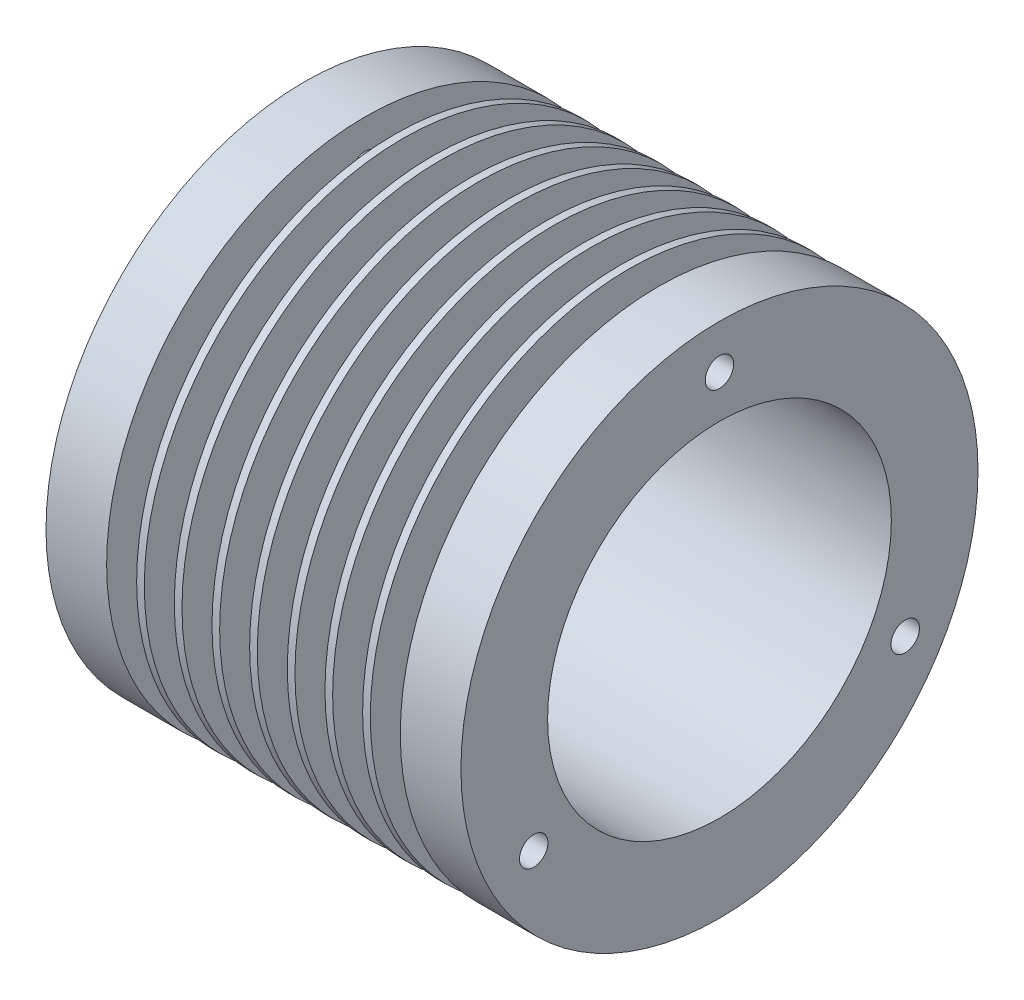
ISO-10303-21;
HEADER;
FILE_DESCRIPTION(('STEP AP214'),'2;1');
FILE_NAME('part.step','',(''),(''),'','','');
FILE_SCHEMA(('AUTOMOTIVE_DESIGN { 1 0 10303 214 1 1 1 1 }'));
ENDSEC;
DATA;
#1=APPLICATION_CONTEXT('core data for automotive mechanical design processes');
#2=APPLICATION_PROTOCOL_DEFINITION('international standard','automotive_design',2000,#1);
#3=PRODUCT_CONTEXT('',#1,'mechanical');
#4=PRODUCT('Part','Part','',(#3));
#5=PRODUCT_RELATED_PRODUCT_CATEGORY('part','',(#4));
#6=PRODUCT_DEFINITION_FORMATION('','',#4);
#7=PRODUCT_DEFINITION_CONTEXT('part definition',#1,'design');
#8=PRODUCT_DEFINITION('design','',#6,#7);
#9=PRODUCT_DEFINITION_SHAPE('','',#8);
#10=(LENGTH_UNIT() NAMED_UNIT(*) SI_UNIT(.MILLI.,.METRE.));
#11=(NAMED_UNIT(*) PLANE_ANGLE_UNIT() SI_UNIT($,.RADIAN.));
#12=(NAMED_UNIT(*) SI_UNIT($,.STERADIAN.) SOLID_ANGLE_UNIT());
#13=UNCERTAINTY_MEASURE_WITH_UNIT(LENGTH_MEASURE(1.E-05),#10,'distance_accuracy_value','');
#14=(GEOMETRIC_REPRESENTATION_CONTEXT(3) GLOBAL_UNCERTAINTY_ASSIGNED_CONTEXT((#13)) GLOBAL_UNIT_ASSIGNED_CONTEXT((#10,
#11,#12)) REPRESENTATION_CONTEXT('',''));
#15=CARTESIAN_POINT('',(0.,0.,0.));
#16=DIRECTION('',(0.,0.,1.));
#17=DIRECTION('',(1.,0.,0.));
#18=AXIS2_PLACEMENT_3D('',#15,#16,#17);
#19=CARTESIAN_POINT('',(33.02,0.,0.));
#20=DIRECTION('',(-1.,0.,0.));
#21=DIRECTION('',(0.,0.,1.));
#22=AXIS2_PLACEMENT_3D('',#19,#20,#21);
#23=PLANE('',#22);
#24=CARTESIAN_POINT('',(33.02,0.,0.));
#25=DIRECTION('',(-1.,0.,0.));
#26=DIRECTION('',(0.,0.,1.));
#27=AXIS2_PLACEMENT_3D('',#24,#25,#26);
#28=CIRCLE('',#27,13.6779);
#29=CARTESIAN_POINT('',(33.02,0.,13.6779));
#30=VERTEX_POINT('',#29);
#31=EDGE_CURVE('E145',#30,#30,#28,.T.);
#32=ORIENTED_EDGE('',*,*,#31,.T.);
#33=EDGE_LOOP('',(#32));
#34=FACE_BOUND('',#33,.T.);
#35=CARTESIAN_POINT('',(33.02,0.,0.));
#36=DIRECTION('',(-1.,0.,0.));
#37=DIRECTION('',(0.,0.,1.));
#38=AXIS2_PLACEMENT_3D('',#35,#36,#37);
#39=CIRCLE('',#38,20.574);
#40=CARTESIAN_POINT('',(33.02,0.,20.574));
#41=VERTEX_POINT('',#40);
#42=EDGE_CURVE('E142',#41,#41,#39,.T.);
#43=ORIENTED_EDGE('',*,*,#42,.F.);
#44=EDGE_LOOP('',(#43));
#45=FACE_BOUND('',#44,.T.);
#46=CARTESIAN_POINT('',(33.02,17.0688,0.));
#47=DIRECTION('',(1.,0.,0.));
#48=DIRECTION('',(0.,0.,-1.));
#49=AXIS2_PLACEMENT_3D('',#46,#47,#48);
#50=CIRCLE('',#49,1.1303);
#51=CARTESIAN_POINT('',(33.02,17.0688,-1.1303));
#52=VERTEX_POINT('',#51);
#53=EDGE_CURVE('E172',#52,#52,#50,.T.);
#54=ORIENTED_EDGE('',*,*,#53,.F.);
#55=EDGE_LOOP('',(#54));
#56=FACE_BOUND('',#55,.T.);
#57=CARTESIAN_POINT('',(33.02,-8.53440000000007,-14.7820144121158));
#58=DIRECTION('',(1.,0.,0.));
#59=DIRECTION('',(0.,0.,-1.));
#60=AXIS2_PLACEMENT_3D('',#57,#58,#59);
#61=CIRCLE('',#60,1.1303);
#62=CARTESIAN_POINT('',(33.02,-8.53440000000007,-15.9123144121158));
#63=VERTEX_POINT('',#62);
#64=EDGE_CURVE('E178',#63,#63,#61,.T.);
#65=ORIENTED_EDGE('',*,*,#64,.F.);
#66=EDGE_LOOP('',(#65));
#67=FACE_BOUND('',#66,.T.);
#68=CARTESIAN_POINT('',(33.02,-8.53439999999986,14.7820144121159));
#69=DIRECTION('',(1.,0.,0.));
#70=DIRECTION('',(0.,0.,-1.));
#71=AXIS2_PLACEMENT_3D('',#68,#69,#70);
#72=CIRCLE('',#71,1.1303);
#73=CARTESIAN_POINT('',(33.02,-8.53439999999986,13.6517144121159));
#74=VERTEX_POINT('',#73);
#75=EDGE_CURVE('E184',#74,#74,#72,.T.);
#76=ORIENTED_EDGE('',*,*,#75,.F.);
#77=EDGE_LOOP('',(#76));
#78=FACE_BOUND('',#77,.T.);
#79=ADVANCED_FACE('F35',(#34,#45,#56,#67,#78),#23,.F.);
#80=CARTESIAN_POINT('',(0.,0.,0.));
#81=DIRECTION('',(1.,0.,0.));
#82=DIRECTION('',(0.,0.,-1.));
#83=AXIS2_PLACEMENT_3D('',#80,#81,#82);
#84=PLANE('',#83);
#85=CARTESIAN_POINT('',(0.,-8.53439999999986,14.7820144121159));
#86=DIRECTION('',(-1.,0.,0.));
#87=DIRECTION('',(0.,0.,1.));
#88=AXIS2_PLACEMENT_3D('',#85,#86,#87);
#89=CIRCLE('',#88,1.13029999999999);
#90=CARTESIAN_POINT('',(0.,-8.53439999999986,15.9123144121159));
#91=VERTEX_POINT('',#90);
#92=EDGE_CURVE('E166',#91,#91,#89,.T.);
#93=ORIENTED_EDGE('',*,*,#92,.F.);
#94=EDGE_LOOP('',(#93));
#95=FACE_BOUND('',#94,.T.);
#96=CARTESIAN_POINT('',(0.,-8.53440000000007,-14.7820144121158));
#97=DIRECTION('',(-1.,0.,0.));
#98=DIRECTION('',(0.,0.,1.));
#99=AXIS2_PLACEMENT_3D('',#96,#97,#98);
#100=CIRCLE('',#99,1.13029999999999);
#101=CARTESIAN_POINT('',(0.,-8.53440000000007,-13.6517144121158));
#102=VERTEX_POINT('',#101);
#103=EDGE_CURVE('E160',#102,#102,#100,.T.);
#104=ORIENTED_EDGE('',*,*,#103,.F.);
#105=EDGE_LOOP('',(#104));
#106=FACE_BOUND('',#105,.T.);
#107=CARTESIAN_POINT('',(0.,17.0688,0.));
#108=DIRECTION('',(-1.,0.,0.));
#109=DIRECTION('',(0.,0.,1.));
#110=AXIS2_PLACEMENT_3D('',#107,#108,#109);
#111=CIRCLE('',#110,1.13029999999999);
#112=CARTESIAN_POINT('',(0.,17.0688,1.13029999999999));
#113=VERTEX_POINT('',#112);
#114=EDGE_CURVE('E154',#113,#113,#111,.T.);
#115=ORIENTED_EDGE('',*,*,#114,.F.);
#116=EDGE_LOOP('',(#115));
#117=FACE_BOUND('',#116,.T.);
#118=CARTESIAN_POINT('',(0.,0.,0.));
#119=DIRECTION('',(-1.,0.,0.));
#120=DIRECTION('',(0.,0.,1.));
#121=AXIS2_PLACEMENT_3D('',#118,#119,#120);
#122=CIRCLE('',#121,13.6779);
#123=CARTESIAN_POINT('',(0.,0.,13.6779));
#124=VERTEX_POINT('',#123);
#125=EDGE_CURVE('E146',#124,#124,#122,.T.);
#126=ORIENTED_EDGE('',*,*,#125,.F.);
#127=EDGE_LOOP('',(#126));
#128=FACE_BOUND('',#127,.T.);
#129=CARTESIAN_POINT('',(0.,0.,0.));
#130=DIRECTION('',(-1.,0.,0.));
#131=DIRECTION('',(0.,0.,1.));
#132=AXIS2_PLACEMENT_3D('',#129,#130,#131);
#133=CIRCLE('',#132,20.574);
#134=CARTESIAN_POINT('',(0.,0.,20.574));
#135=VERTEX_POINT('',#134);
#136=EDGE_CURVE('E10',#135,#135,#133,.T.);
#137=ORIENTED_EDGE('',*,*,#136,.T.);
#138=EDGE_LOOP('',(#137));
#139=FACE_BOUND('',#138,.T.);
#140=ADVANCED_FACE('F37',(#95,#106,#117,#128,#139),#84,.F.);
#141=CARTESIAN_POINT('',(0.,0.,0.));
#142=DIRECTION('',(-1.,0.,0.));
#143=DIRECTION('',(0.,0.,1.));
#144=AXIS2_PLACEMENT_3D('',#141,#142,#143);
#145=CYLINDRICAL_SURFACE('',#144,20.574);
#146=ORIENTED_EDGE('',*,*,#136,.F.);
#147=EDGE_LOOP('',(#146));
#148=FACE_BOUND('',#147,.T.);
#149=CARTESIAN_POINT('',(4.826,0.,0.));
#150=DIRECTION('',(-1.,0.,0.));
#151=DIRECTION('',(0.,0.,1.));
#152=AXIS2_PLACEMENT_3D('',#149,#150,#151);
#153=CIRCLE('',#152,20.574);
#154=CARTESIAN_POINT('',(4.826,0.,20.574));
#155=VERTEX_POINT('',#154);
#156=EDGE_CURVE('E42',#155,#155,#153,.T.);
#157=ORIENTED_EDGE('',*,*,#156,.T.);
#158=EDGE_LOOP('',(#157));
#159=FACE_BOUND('',#158,.T.);
#160=ADVANCED_FACE('F196',(#148,#159),#145,.T.);
#161=CARTESIAN_POINT('',(4.826,20.574,0.));
#162=DIRECTION('',(-1.,0.,0.));
#163=DIRECTION('',(0.,0.,1.));
#164=AXIS2_PLACEMENT_3D('',#161,#162,#163);
#165=PLANE('',#164);
#166=CARTESIAN_POINT('',(4.826,-8.53439999999986,14.7820144121159));
#167=DIRECTION('',(-1.,0.,0.));
#168=DIRECTION('',(0.,0.,1.));
#169=AXIS2_PLACEMENT_3D('',#166,#167,#168);
#170=CIRCLE('',#169,1.13029999999999);
#171=CARTESIAN_POINT('',(4.826,-8.53439999999986,15.9123144121159));
#172=VERTEX_POINT('',#171);
#173=EDGE_CURVE('E163',#172,#172,#170,.T.);
#174=ORIENTED_EDGE('',*,*,#173,.T.);
#175=EDGE_LOOP('',(#174));
#176=FACE_BOUND('',#175,.T.);
#177=CARTESIAN_POINT('',(4.826,-8.53440000000007,-14.7820144121158));
#178=DIRECTION('',(-1.,0.,0.));
#179=DIRECTION('',(0.,0.,1.));
#180=AXIS2_PLACEMENT_3D('',#177,#178,#179);
#181=CIRCLE('',#180,1.13029999999999);
#182=CARTESIAN_POINT('',(4.826,-8.53440000000007,-13.6517144121158));
#183=VERTEX_POINT('',#182);
#184=EDGE_CURVE('E157',#183,#183,#181,.T.);
#185=ORIENTED_EDGE('',*,*,#184,.T.);
#186=EDGE_LOOP('',(#185));
#187=FACE_BOUND('',#186,.T.);
#188=CARTESIAN_POINT('',(4.826,17.0688,0.));
#189=DIRECTION('',(-1.,0.,0.));
#190=DIRECTION('',(0.,0.,1.));
#191=AXIS2_PLACEMENT_3D('',#188,#189,#190);
#192=CIRCLE('',#191,1.13029999999999);
#193=CARTESIAN_POINT('',(4.826,17.0688,1.13029999999999));
#194=VERTEX_POINT('',#193);
#195=EDGE_CURVE('E149',#194,#194,#192,.T.);
#196=ORIENTED_EDGE('',*,*,#195,.T.);
#197=EDGE_LOOP('',(#196));
#198=FACE_BOUND('',#197,.T.);
#199=ORIENTED_EDGE('',*,*,#156,.F.);
#200=EDGE_LOOP('',(#199));
#201=FACE_BOUND('',#200,.T.);
#202=CARTESIAN_POINT('',(4.826,0.,0.));
#203=DIRECTION('',(-1.,0.,0.));
#204=DIRECTION('',(0.,0.,1.));
#205=AXIS2_PLACEMENT_3D('',#202,#203,#204);
#206=CIRCLE('',#205,14.605);
#207=CARTESIAN_POINT('',(4.826,0.,14.605));
#208=VERTEX_POINT('',#207);
#209=EDGE_CURVE('E46',#208,#208,#206,.T.);
#210=ORIENTED_EDGE('',*,*,#209,.T.);
#211=EDGE_LOOP('',(#210));
#212=FACE_BOUND('',#211,.T.);
#213=ADVANCED_FACE('F326',(#176,#187,#198,#201,#212),#165,.F.);
#214=CARTESIAN_POINT('',(0.,0.,0.));
#215=DIRECTION('',(-1.,0.,0.));
#216=DIRECTION('',(0.,0.,1.));
#217=AXIS2_PLACEMENT_3D('',#214,#215,#216);
#218=CYLINDRICAL_SURFACE('',#217,14.605);
#219=ORIENTED_EDGE('',*,*,#209,.F.);
#220=EDGE_LOOP('',(#219));
#221=FACE_BOUND('',#220,.T.);
#222=CARTESIAN_POINT('',(7.2136,0.,0.));
#223=DIRECTION('',(-1.,0.,0.));
#224=DIRECTION('',(0.,0.,1.));
#225=AXIS2_PLACEMENT_3D('',#222,#223,#224);
#226=CIRCLE('',#225,14.605);
#227=CARTESIAN_POINT('',(7.2136,0.,14.605));
#228=VERTEX_POINT('',#227);
#229=EDGE_CURVE('E50',#228,#228,#226,.T.);
#230=ORIENTED_EDGE('',*,*,#229,.T.);
#231=EDGE_LOOP('',(#230));
#232=FACE_BOUND('',#231,.T.);
#233=ADVANCED_FACE('F322',(#221,#232),#218,.T.);
#234=CARTESIAN_POINT('',(7.2136,14.605,0.));
#235=DIRECTION('',(1.,0.,0.));
#236=DIRECTION('',(0.,0.,-1.));
#237=AXIS2_PLACEMENT_3D('',#234,#235,#236);
#238=PLANE('',#237);
#239=ORIENTED_EDGE('',*,*,#229,.F.);
#240=EDGE_LOOP('',(#239));
#241=FACE_BOUND('',#240,.T.);
#242=CARTESIAN_POINT('',(7.2136,0.,0.));
#243=DIRECTION('',(-1.,0.,0.));
#244=DIRECTION('',(0.,0.,1.));
#245=AXIS2_PLACEMENT_3D('',#242,#243,#244);
#246=CIRCLE('',#245,20.574);
#247=CARTESIAN_POINT('',(7.2136,0.,20.574));
#248=VERTEX_POINT('',#247);
#249=EDGE_CURVE('E55',#248,#248,#246,.T.);
#250=ORIENTED_EDGE('',*,*,#249,.T.);
#251=EDGE_LOOP('',(#250));
#252=FACE_BOUND('',#251,.T.);
#253=ADVANCED_FACE('F318',(#241,#252),#238,.F.);
#254=CARTESIAN_POINT('',(0.,0.,0.));
#255=DIRECTION('',(-1.,0.,0.));
#256=DIRECTION('',(0.,0.,1.));
#257=AXIS2_PLACEMENT_3D('',#254,#255,#256);
#258=CYLINDRICAL_SURFACE('',#257,20.574);
#259=ORIENTED_EDGE('',*,*,#249,.F.);
#260=EDGE_LOOP('',(#259));
#261=FACE_BOUND('',#260,.T.);
#262=CARTESIAN_POINT('',(7.8232,0.,0.));
#263=DIRECTION('',(-1.,0.,0.));
#264=DIRECTION('',(0.,0.,1.));
#265=AXIS2_PLACEMENT_3D('',#262,#263,#264);
#266=CIRCLE('',#265,20.574);
#267=CARTESIAN_POINT('',(7.8232,0.,20.574));
#268=VERTEX_POINT('',#267);
#269=EDGE_CURVE('E58',#268,#268,#266,.T.);
#270=ORIENTED_EDGE('',*,*,#269,.T.);
#271=EDGE_LOOP('',(#270));
#272=FACE_BOUND('',#271,.T.);
#273=ADVANCED_FACE('F314',(#261,#272),#258,.T.);
#274=CARTESIAN_POINT('',(7.8232,20.574,0.));
#275=DIRECTION('',(-1.,0.,0.));
#276=DIRECTION('',(0.,0.,1.));
#277=AXIS2_PLACEMENT_3D('',#274,#275,#276);
#278=PLANE('',#277);
#279=ORIENTED_EDGE('',*,*,#269,.F.);
#280=EDGE_LOOP('',(#279));
#281=FACE_BOUND('',#280,.T.);
#282=CARTESIAN_POINT('',(7.8232,0.,0.));
#283=DIRECTION('',(-1.,0.,0.));
#284=DIRECTION('',(0.,0.,1.));
#285=AXIS2_PLACEMENT_3D('',#282,#283,#284);
#286=CIRCLE('',#285,14.605);
#287=CARTESIAN_POINT('',(7.8232,0.,14.605));
#288=VERTEX_POINT('',#287);
#289=EDGE_CURVE('E61',#288,#288,#286,.T.);
#290=ORIENTED_EDGE('',*,*,#289,.T.);
#291=EDGE_LOOP('',(#290));
#292=FACE_BOUND('',#291,.T.);
#293=ADVANCED_FACE('F310',(#281,#292),#278,.F.);
#294=CARTESIAN_POINT('',(0.,0.,0.));
#295=DIRECTION('',(-1.,0.,0.));
#296=DIRECTION('',(0.,0.,1.));
#297=AXIS2_PLACEMENT_3D('',#294,#295,#296);
#298=CYLINDRICAL_SURFACE('',#297,14.605);
#299=ORIENTED_EDGE('',*,*,#289,.F.);
#300=EDGE_LOOP('',(#299));
#301=FACE_BOUND('',#300,.T.);
#302=CARTESIAN_POINT('',(10.2108,0.,0.));
#303=DIRECTION('',(-1.,0.,0.));
#304=DIRECTION('',(0.,0.,1.));
#305=AXIS2_PLACEMENT_3D('',#302,#303,#304);
#306=CIRCLE('',#305,14.605);
#307=CARTESIAN_POINT('',(10.2108,0.,14.605));
#308=VERTEX_POINT('',#307);
#309=EDGE_CURVE('E64',#308,#308,#306,.T.);
#310=ORIENTED_EDGE('',*,*,#309,.T.);
#311=EDGE_LOOP('',(#310));
#312=FACE_BOUND('',#311,.T.);
#313=ADVANCED_FACE('F306',(#301,#312),#298,.T.);
#314=CARTESIAN_POINT('',(10.2108,14.605,0.));
#315=DIRECTION('',(1.,0.,0.));
#316=DIRECTION('',(0.,0.,-1.));
#317=AXIS2_PLACEMENT_3D('',#314,#315,#316);
#318=PLANE('',#317);
#319=ORIENTED_EDGE('',*,*,#309,.F.);
#320=EDGE_LOOP('',(#319));
#321=FACE_BOUND('',#320,.T.);
#322=CARTESIAN_POINT('',(10.2108,0.,0.));
#323=DIRECTION('',(-1.,0.,0.));
#324=DIRECTION('',(0.,0.,1.));
#325=AXIS2_PLACEMENT_3D('',#322,#323,#324);
#326=CIRCLE('',#325,20.574);
#327=CARTESIAN_POINT('',(10.2108,0.,20.574));
#328=VERTEX_POINT('',#327);
#329=EDGE_CURVE('E67',#328,#328,#326,.T.);
#330=ORIENTED_EDGE('',*,*,#329,.T.);
#331=EDGE_LOOP('',(#330));
#332=FACE_BOUND('',#331,.T.);
#333=ADVANCED_FACE('F302',(#321,#332),#318,.F.);
#334=CARTESIAN_POINT('',(0.,0.,0.));
#335=DIRECTION('',(-1.,0.,0.));
#336=DIRECTION('',(0.,0.,1.));
#337=AXIS2_PLACEMENT_3D('',#334,#335,#336);
#338=CYLINDRICAL_SURFACE('',#337,20.574);
#339=ORIENTED_EDGE('',*,*,#329,.F.);
#340=EDGE_LOOP('',(#339));
#341=FACE_BOUND('',#340,.T.);
#342=CARTESIAN_POINT('',(10.8204,0.,0.));
#343=DIRECTION('',(-1.,0.,0.));
#344=DIRECTION('',(0.,0.,1.));
#345=AXIS2_PLACEMENT_3D('',#342,#343,#344);
#346=CIRCLE('',#345,20.574);
#347=CARTESIAN_POINT('',(10.8204,0.,20.574));
#348=VERTEX_POINT('',#347);
#349=EDGE_CURVE('E70',#348,#348,#346,.T.);
#350=ORIENTED_EDGE('',*,*,#349,.T.);
#351=EDGE_LOOP('',(#350));
#352=FACE_BOUND('',#351,.T.);
#353=ADVANCED_FACE('F298',(#341,#352),#338,.T.);
#354=CARTESIAN_POINT('',(10.8204,20.574,0.));
#355=DIRECTION('',(-1.,0.,0.));
#356=DIRECTION('',(0.,0.,1.));
#357=AXIS2_PLACEMENT_3D('',#354,#355,#356);
#358=PLANE('',#357);
#359=ORIENTED_EDGE('',*,*,#349,.F.);
#360=EDGE_LOOP('',(#359));
#361=FACE_BOUND('',#360,.T.);
#362=CARTESIAN_POINT('',(10.8204,0.,0.));
#363=DIRECTION('',(-1.,0.,0.));
#364=DIRECTION('',(0.,0.,1.));
#365=AXIS2_PLACEMENT_3D('',#362,#363,#364);
#366=CIRCLE('',#365,14.605);
#367=CARTESIAN_POINT('',(10.8204,0.,14.605));
#368=VERTEX_POINT('',#367);
#369=EDGE_CURVE('E73',#368,#368,#366,.T.);
#370=ORIENTED_EDGE('',*,*,#369,.T.);
#371=EDGE_LOOP('',(#370));
#372=FACE_BOUND('',#371,.T.);
#373=ADVANCED_FACE('F294',(#361,#372),#358,.F.);
#374=CARTESIAN_POINT('',(0.,0.,0.));
#375=DIRECTION('',(-1.,0.,0.));
#376=DIRECTION('',(0.,0.,1.));
#377=AXIS2_PLACEMENT_3D('',#374,#375,#376);
#378=CYLINDRICAL_SURFACE('',#377,14.605);
#379=ORIENTED_EDGE('',*,*,#369,.F.);
#380=EDGE_LOOP('',(#379));
#381=FACE_BOUND('',#380,.T.);
#382=CARTESIAN_POINT('',(13.208,0.,0.));
#383=DIRECTION('',(-1.,0.,0.));
#384=DIRECTION('',(0.,0.,1.));
#385=AXIS2_PLACEMENT_3D('',#382,#383,#384);
#386=CIRCLE('',#385,14.605);
#387=CARTESIAN_POINT('',(13.208,0.,14.605));
#388=VERTEX_POINT('',#387);
#389=EDGE_CURVE('E76',#388,#388,#386,.T.);
#390=ORIENTED_EDGE('',*,*,#389,.T.);
#391=EDGE_LOOP('',(#390));
#392=FACE_BOUND('',#391,.T.);
#393=ADVANCED_FACE('F290',(#381,#392),#378,.T.);
#394=CARTESIAN_POINT('',(13.208,14.605,0.));
#395=DIRECTION('',(1.,0.,0.));
#396=DIRECTION('',(0.,0.,-1.));
#397=AXIS2_PLACEMENT_3D('',#394,#395,#396);
#398=PLANE('',#397);
#399=ORIENTED_EDGE('',*,*,#389,.F.);
#400=EDGE_LOOP('',(#399));
#401=FACE_BOUND('',#400,.T.);
#402=CARTESIAN_POINT('',(13.208,0.,0.));
#403=DIRECTION('',(-1.,0.,0.));
#404=DIRECTION('',(0.,0.,1.));
#405=AXIS2_PLACEMENT_3D('',#402,#403,#404);
#406=CIRCLE('',#405,20.574);
#407=CARTESIAN_POINT('',(13.208,0.,20.574));
#408=VERTEX_POINT('',#407);
#409=EDGE_CURVE('E79',#408,#408,#406,.T.);
#410=ORIENTED_EDGE('',*,*,#409,.T.);
#411=EDGE_LOOP('',(#410));
#412=FACE_BOUND('',#411,.T.);
#413=ADVANCED_FACE('F286',(#401,#412),#398,.F.);
#414=CARTESIAN_POINT('',(0.,0.,0.));
#415=DIRECTION('',(-1.,0.,0.));
#416=DIRECTION('',(0.,0.,1.));
#417=AXIS2_PLACEMENT_3D('',#414,#415,#416);
#418=CYLINDRICAL_SURFACE('',#417,20.574);
#419=ORIENTED_EDGE('',*,*,#409,.F.);
#420=EDGE_LOOP('',(#419));
#421=FACE_BOUND('',#420,.T.);
#422=CARTESIAN_POINT('',(13.8176,0.,0.));
#423=DIRECTION('',(-1.,0.,0.));
#424=DIRECTION('',(0.,0.,1.));
#425=AXIS2_PLACEMENT_3D('',#422,#423,#424);
#426=CIRCLE('',#425,20.574);
#427=CARTESIAN_POINT('',(13.8176,0.,20.574));
#428=VERTEX_POINT('',#427);
#429=EDGE_CURVE('E82',#428,#428,#426,.T.);
#430=ORIENTED_EDGE('',*,*,#429,.T.);
#431=EDGE_LOOP('',(#430));
#432=FACE_BOUND('',#431,.T.);
#433=ADVANCED_FACE('F282',(#421,#432),#418,.T.);
#434=CARTESIAN_POINT('',(13.8176,20.574,0.));
#435=DIRECTION('',(-1.,0.,0.));
#436=DIRECTION('',(0.,0.,1.));
#437=AXIS2_PLACEMENT_3D('',#434,#435,#436);
#438=PLANE('',#437);
#439=ORIENTED_EDGE('',*,*,#429,.F.);
#440=EDGE_LOOP('',(#439));
#441=FACE_BOUND('',#440,.T.);
#442=CARTESIAN_POINT('',(13.8176,0.,0.));
#443=DIRECTION('',(-1.,0.,0.));
#444=DIRECTION('',(0.,0.,1.));
#445=AXIS2_PLACEMENT_3D('',#442,#443,#444);
#446=CIRCLE('',#445,14.605);
#447=CARTESIAN_POINT('',(13.8176,0.,14.605));
#448=VERTEX_POINT('',#447);
#449=EDGE_CURVE('E85',#448,#448,#446,.T.);
#450=ORIENTED_EDGE('',*,*,#449,.T.);
#451=EDGE_LOOP('',(#450));
#452=FACE_BOUND('',#451,.T.);
#453=ADVANCED_FACE('F278',(#441,#452),#438,.F.);
#454=CARTESIAN_POINT('',(0.,0.,0.));
#455=DIRECTION('',(-1.,0.,0.));
#456=DIRECTION('',(0.,0.,1.));
#457=AXIS2_PLACEMENT_3D('',#454,#455,#456);
#458=CYLINDRICAL_SURFACE('',#457,14.605);
#459=ORIENTED_EDGE('',*,*,#449,.F.);
#460=EDGE_LOOP('',(#459));
#461=FACE_BOUND('',#460,.T.);
#462=CARTESIAN_POINT('',(16.2052,0.,0.));
#463=DIRECTION('',(-1.,0.,0.));
#464=DIRECTION('',(0.,0.,1.));
#465=AXIS2_PLACEMENT_3D('',#462,#463,#464);
#466=CIRCLE('',#465,14.605);
#467=CARTESIAN_POINT('',(16.2052,0.,14.605));
#468=VERTEX_POINT('',#467);
#469=EDGE_CURVE('E88',#468,#468,#466,.T.);
#470=ORIENTED_EDGE('',*,*,#469,.T.);
#471=EDGE_LOOP('',(#470));
#472=FACE_BOUND('',#471,.T.);
#473=ADVANCED_FACE('F274',(#461,#472),#458,.T.);
#474=CARTESIAN_POINT('',(16.2052,14.605,0.));
#475=DIRECTION('',(1.,0.,0.));
#476=DIRECTION('',(0.,0.,-1.));
#477=AXIS2_PLACEMENT_3D('',#474,#475,#476);
#478=PLANE('',#477);
#479=ORIENTED_EDGE('',*,*,#469,.F.);
#480=EDGE_LOOP('',(#479));
#481=FACE_BOUND('',#480,.T.);
#482=CARTESIAN_POINT('',(16.2052,0.,0.));
#483=DIRECTION('',(-1.,0.,0.));
#484=DIRECTION('',(0.,0.,1.));
#485=AXIS2_PLACEMENT_3D('',#482,#483,#484);
#486=CIRCLE('',#485,20.574);
#487=CARTESIAN_POINT('',(16.2052,0.,20.574));
#488=VERTEX_POINT('',#487);
#489=EDGE_CURVE('E91',#488,#488,#486,.T.);
#490=ORIENTED_EDGE('',*,*,#489,.T.);
#491=EDGE_LOOP('',(#490));
#492=FACE_BOUND('',#491,.T.);
#493=ADVANCED_FACE('F270',(#481,#492),#478,.F.);
#494=CARTESIAN_POINT('',(0.,0.,0.));
#495=DIRECTION('',(-1.,0.,0.));
#496=DIRECTION('',(0.,0.,1.));
#497=AXIS2_PLACEMENT_3D('',#494,#495,#496);
#498=CYLINDRICAL_SURFACE('',#497,20.574);
#499=ORIENTED_EDGE('',*,*,#489,.F.);
#500=EDGE_LOOP('',(#499));
#501=FACE_BOUND('',#500,.T.);
#502=CARTESIAN_POINT('',(16.8148,0.,0.));
#503=DIRECTION('',(-1.,0.,0.));
#504=DIRECTION('',(0.,0.,1.));
#505=AXIS2_PLACEMENT_3D('',#502,#503,#504);
#506=CIRCLE('',#505,20.574);
#507=CARTESIAN_POINT('',(16.8148,0.,20.574));
#508=VERTEX_POINT('',#507);
#509=EDGE_CURVE('E94',#508,#508,#506,.T.);
#510=ORIENTED_EDGE('',*,*,#509,.T.);
#511=EDGE_LOOP('',(#510));
#512=FACE_BOUND('',#511,.T.);
#513=ADVANCED_FACE('F266',(#501,#512),#498,.T.);
#514=CARTESIAN_POINT('',(16.8148,20.574,0.));
#515=DIRECTION('',(-1.,0.,0.));
#516=DIRECTION('',(0.,0.,1.));
#517=AXIS2_PLACEMENT_3D('',#514,#515,#516);
#518=PLANE('',#517);
#519=ORIENTED_EDGE('',*,*,#509,.F.);
#520=EDGE_LOOP('',(#519));
#521=FACE_BOUND('',#520,.T.);
#522=CARTESIAN_POINT('',(16.8148,0.,0.));
#523=DIRECTION('',(-1.,0.,0.));
#524=DIRECTION('',(0.,0.,1.));
#525=AXIS2_PLACEMENT_3D('',#522,#523,#524);
#526=CIRCLE('',#525,14.605);
#527=CARTESIAN_POINT('',(16.8148,0.,14.605));
#528=VERTEX_POINT('',#527);
#529=EDGE_CURVE('E97',#528,#528,#526,.T.);
#530=ORIENTED_EDGE('',*,*,#529,.T.);
#531=EDGE_LOOP('',(#530));
#532=FACE_BOUND('',#531,.T.);
#533=ADVANCED_FACE('F262',(#521,#532),#518,.F.);
#534=CARTESIAN_POINT('',(0.,0.,0.));
#535=DIRECTION('',(-1.,0.,0.));
#536=DIRECTION('',(0.,0.,1.));
#537=AXIS2_PLACEMENT_3D('',#534,#535,#536);
#538=CYLINDRICAL_SURFACE('',#537,14.605);
#539=ORIENTED_EDGE('',*,*,#529,.F.);
#540=EDGE_LOOP('',(#539));
#541=FACE_BOUND('',#540,.T.);
#542=CARTESIAN_POINT('',(19.2024,0.,0.));
#543=DIRECTION('',(-1.,0.,0.));
#544=DIRECTION('',(0.,0.,1.));
#545=AXIS2_PLACEMENT_3D('',#542,#543,#544);
#546=CIRCLE('',#545,14.605);
#547=CARTESIAN_POINT('',(19.2024,0.,14.605));
#548=VERTEX_POINT('',#547);
#549=EDGE_CURVE('E100',#548,#548,#546,.T.);
#550=ORIENTED_EDGE('',*,*,#549,.T.);
#551=EDGE_LOOP('',(#550));
#552=FACE_BOUND('',#551,.T.);
#553=ADVANCED_FACE('F258',(#541,#552),#538,.T.);
#554=CARTESIAN_POINT('',(19.2024,14.605,0.));
#555=DIRECTION('',(1.,0.,0.));
#556=DIRECTION('',(0.,0.,-1.));
#557=AXIS2_PLACEMENT_3D('',#554,#555,#556);
#558=PLANE('',#557);
#559=ORIENTED_EDGE('',*,*,#549,.F.);
#560=EDGE_LOOP('',(#559));
#561=FACE_BOUND('',#560,.T.);
#562=CARTESIAN_POINT('',(19.2024,0.,0.));
#563=DIRECTION('',(-1.,0.,0.));
#564=DIRECTION('',(0.,0.,1.));
#565=AXIS2_PLACEMENT_3D('',#562,#563,#564);
#566=CIRCLE('',#565,20.574);
#567=CARTESIAN_POINT('',(19.2024,0.,20.574));
#568=VERTEX_POINT('',#567);
#569=EDGE_CURVE('E103',#568,#568,#566,.T.);
#570=ORIENTED_EDGE('',*,*,#569,.T.);
#571=EDGE_LOOP('',(#570));
#572=FACE_BOUND('',#571,.T.);
#573=ADVANCED_FACE('F254',(#561,#572),#558,.F.);
#574=CARTESIAN_POINT('',(0.,0.,0.));
#575=DIRECTION('',(-1.,0.,0.));
#576=DIRECTION('',(0.,0.,1.));
#577=AXIS2_PLACEMENT_3D('',#574,#575,#576);
#578=CYLINDRICAL_SURFACE('',#577,20.574);
#579=ORIENTED_EDGE('',*,*,#569,.F.);
#580=EDGE_LOOP('',(#579));
#581=FACE_BOUND('',#580,.T.);
#582=CARTESIAN_POINT('',(19.812,0.,0.));
#583=DIRECTION('',(-1.,0.,0.));
#584=DIRECTION('',(0.,0.,1.));
#585=AXIS2_PLACEMENT_3D('',#582,#583,#584);
#586=CIRCLE('',#585,20.574);
#587=CARTESIAN_POINT('',(19.812,0.,20.574));
#588=VERTEX_POINT('',#587);
#589=EDGE_CURVE('E106',#588,#588,#586,.T.);
#590=ORIENTED_EDGE('',*,*,#589,.T.);
#591=EDGE_LOOP('',(#590));
#592=FACE_BOUND('',#591,.T.);
#593=ADVANCED_FACE('F250',(#581,#592),#578,.T.);
#594=CARTESIAN_POINT('',(19.812,20.574,0.));
#595=DIRECTION('',(-1.,0.,0.));
#596=DIRECTION('',(0.,0.,1.));
#597=AXIS2_PLACEMENT_3D('',#594,#595,#596);
#598=PLANE('',#597);
#599=ORIENTED_EDGE('',*,*,#589,.F.);
#600=EDGE_LOOP('',(#599));
#601=FACE_BOUND('',#600,.T.);
#602=CARTESIAN_POINT('',(19.812,0.,0.));
#603=DIRECTION('',(-1.,0.,0.));
#604=DIRECTION('',(0.,0.,1.));
#605=AXIS2_PLACEMENT_3D('',#602,#603,#604);
#606=CIRCLE('',#605,14.605);
#607=CARTESIAN_POINT('',(19.812,0.,14.605));
#608=VERTEX_POINT('',#607);
#609=EDGE_CURVE('E109',#608,#608,#606,.T.);
#610=ORIENTED_EDGE('',*,*,#609,.T.);
#611=EDGE_LOOP('',(#610));
#612=FACE_BOUND('',#611,.T.);
#613=ADVANCED_FACE('F246',(#601,#612),#598,.F.);
#614=CARTESIAN_POINT('',(0.,0.,0.));
#615=DIRECTION('',(-1.,0.,0.));
#616=DIRECTION('',(0.,0.,1.));
#617=AXIS2_PLACEMENT_3D('',#614,#615,#616);
#618=CYLINDRICAL_SURFACE('',#617,14.605);
#619=ORIENTED_EDGE('',*,*,#609,.F.);
#620=EDGE_LOOP('',(#619));
#621=FACE_BOUND('',#620,.T.);
#622=CARTESIAN_POINT('',(22.1996,0.,0.));
#623=DIRECTION('',(-1.,0.,0.));
#624=DIRECTION('',(0.,0.,1.));
#625=AXIS2_PLACEMENT_3D('',#622,#623,#624);
#626=CIRCLE('',#625,14.605);
#627=CARTESIAN_POINT('',(22.1996,0.,14.605));
#628=VERTEX_POINT('',#627);
#629=EDGE_CURVE('E112',#628,#628,#626,.T.);
#630=ORIENTED_EDGE('',*,*,#629,.T.);
#631=EDGE_LOOP('',(#630));
#632=FACE_BOUND('',#631,.T.);
#633=ADVANCED_FACE('F242',(#621,#632),#618,.T.);
#634=CARTESIAN_POINT('',(22.1996,14.605,0.));
#635=DIRECTION('',(1.,0.,0.));
#636=DIRECTION('',(0.,0.,-1.));
#637=AXIS2_PLACEMENT_3D('',#634,#635,#636);
#638=PLANE('',#637);
#639=ORIENTED_EDGE('',*,*,#629,.F.);
#640=EDGE_LOOP('',(#639));
#641=FACE_BOUND('',#640,.T.);
#642=CARTESIAN_POINT('',(22.1996,0.,0.));
#643=DIRECTION('',(-1.,0.,0.));
#644=DIRECTION('',(0.,0.,1.));
#645=AXIS2_PLACEMENT_3D('',#642,#643,#644);
#646=CIRCLE('',#645,20.574);
#647=CARTESIAN_POINT('',(22.1996,0.,20.574));
#648=VERTEX_POINT('',#647);
#649=EDGE_CURVE('E115',#648,#648,#646,.T.);
#650=ORIENTED_EDGE('',*,*,#649,.T.);
#651=EDGE_LOOP('',(#650));
#652=FACE_BOUND('',#651,.T.);
#653=ADVANCED_FACE('F238',(#641,#652),#638,.F.);
#654=CARTESIAN_POINT('',(0.,0.,0.));
#655=DIRECTION('',(-1.,0.,0.));
#656=DIRECTION('',(0.,0.,1.));
#657=AXIS2_PLACEMENT_3D('',#654,#655,#656);
#658=CYLINDRICAL_SURFACE('',#657,20.574);
#659=ORIENTED_EDGE('',*,*,#649,.F.);
#660=EDGE_LOOP('',(#659));
#661=FACE_BOUND('',#660,.T.);
#662=CARTESIAN_POINT('',(22.8092,0.,0.));
#663=DIRECTION('',(-1.,0.,0.));
#664=DIRECTION('',(0.,0.,1.));
#665=AXIS2_PLACEMENT_3D('',#662,#663,#664);
#666=CIRCLE('',#665,20.574);
#667=CARTESIAN_POINT('',(22.8092,0.,20.574));
#668=VERTEX_POINT('',#667);
#669=EDGE_CURVE('E118',#668,#668,#666,.T.);
#670=ORIENTED_EDGE('',*,*,#669,.T.);
#671=EDGE_LOOP('',(#670));
#672=FACE_BOUND('',#671,.T.);
#673=ADVANCED_FACE('F234',(#661,#672),#658,.T.);
#674=CARTESIAN_POINT('',(22.8092,20.574,0.));
#675=DIRECTION('',(-1.,0.,0.));
#676=DIRECTION('',(0.,0.,1.));
#677=AXIS2_PLACEMENT_3D('',#674,#675,#676);
#678=PLANE('',#677);
#679=ORIENTED_EDGE('',*,*,#669,.F.);
#680=EDGE_LOOP('',(#679));
#681=FACE_BOUND('',#680,.T.);
#682=CARTESIAN_POINT('',(22.8092,0.,0.));
#683=DIRECTION('',(-1.,0.,0.));
#684=DIRECTION('',(0.,0.,1.));
#685=AXIS2_PLACEMENT_3D('',#682,#683,#684);
#686=CIRCLE('',#685,14.605);
#687=CARTESIAN_POINT('',(22.8092,0.,14.605));
#688=VERTEX_POINT('',#687);
#689=EDGE_CURVE('E121',#688,#688,#686,.T.);
#690=ORIENTED_EDGE('',*,*,#689,.T.);
#691=EDGE_LOOP('',(#690));
#692=FACE_BOUND('',#691,.T.);
#693=ADVANCED_FACE('F230',(#681,#692),#678,.F.);
#694=CARTESIAN_POINT('',(0.,0.,0.));
#695=DIRECTION('',(-1.,0.,0.));
#696=DIRECTION('',(0.,0.,1.));
#697=AXIS2_PLACEMENT_3D('',#694,#695,#696);
#698=CYLINDRICAL_SURFACE('',#697,14.605);
#699=ORIENTED_EDGE('',*,*,#689,.F.);
#700=EDGE_LOOP('',(#699));
#701=FACE_BOUND('',#700,.T.);
#702=CARTESIAN_POINT('',(25.1968,0.,0.));
#703=DIRECTION('',(-1.,0.,0.));
#704=DIRECTION('',(0.,0.,1.));
#705=AXIS2_PLACEMENT_3D('',#702,#703,#704);
#706=CIRCLE('',#705,14.605);
#707=CARTESIAN_POINT('',(25.1968,0.,14.605));
#708=VERTEX_POINT('',#707);
#709=EDGE_CURVE('E124',#708,#708,#706,.T.);
#710=ORIENTED_EDGE('',*,*,#709,.T.);
#711=EDGE_LOOP('',(#710));
#712=FACE_BOUND('',#711,.T.);
#713=ADVANCED_FACE('F226',(#701,#712),#698,.T.);
#714=CARTESIAN_POINT('',(25.1968,14.605,0.));
#715=DIRECTION('',(1.,0.,0.));
#716=DIRECTION('',(0.,0.,-1.));
#717=AXIS2_PLACEMENT_3D('',#714,#715,#716);
#718=PLANE('',#717);
#719=ORIENTED_EDGE('',*,*,#709,.F.);
#720=EDGE_LOOP('',(#719));
#721=FACE_BOUND('',#720,.T.);
#722=CARTESIAN_POINT('',(25.1968,0.,0.));
#723=DIRECTION('',(-1.,0.,0.));
#724=DIRECTION('',(0.,0.,1.));
#725=AXIS2_PLACEMENT_3D('',#722,#723,#724);
#726=CIRCLE('',#725,20.574);
#727=CARTESIAN_POINT('',(25.1968,0.,20.574));
#728=VERTEX_POINT('',#727);
#729=EDGE_CURVE('E127',#728,#728,#726,.T.);
#730=ORIENTED_EDGE('',*,*,#729,.T.);
#731=EDGE_LOOP('',(#730));
#732=FACE_BOUND('',#731,.T.);
#733=ADVANCED_FACE('F222',(#721,#732),#718,.F.);
#734=CARTESIAN_POINT('',(0.,0.,0.));
#735=DIRECTION('',(-1.,0.,0.));
#736=DIRECTION('',(0.,0.,1.));
#737=AXIS2_PLACEMENT_3D('',#734,#735,#736);
#738=CYLINDRICAL_SURFACE('',#737,20.574);
#739=ORIENTED_EDGE('',*,*,#729,.F.);
#740=EDGE_LOOP('',(#739));
#741=FACE_BOUND('',#740,.T.);
#742=CARTESIAN_POINT('',(25.8064,0.,0.));
#743=DIRECTION('',(-1.,0.,0.));
#744=DIRECTION('',(0.,0.,1.));
#745=AXIS2_PLACEMENT_3D('',#742,#743,#744);
#746=CIRCLE('',#745,20.574);
#747=CARTESIAN_POINT('',(25.8064,0.,20.574));
#748=VERTEX_POINT('',#747);
#749=EDGE_CURVE('E130',#748,#748,#746,.T.);
#750=ORIENTED_EDGE('',*,*,#749,.T.);
#751=EDGE_LOOP('',(#750));
#752=FACE_BOUND('',#751,.T.);
#753=ADVANCED_FACE('F218',(#741,#752),#738,.T.);
#754=CARTESIAN_POINT('',(25.8064,20.574,0.));
#755=DIRECTION('',(-1.,0.,0.));
#756=DIRECTION('',(0.,0.,1.));
#757=AXIS2_PLACEMENT_3D('',#754,#755,#756);
#758=PLANE('',#757);
#759=ORIENTED_EDGE('',*,*,#749,.F.);
#760=EDGE_LOOP('',(#759));
#761=FACE_BOUND('',#760,.T.);
#762=CARTESIAN_POINT('',(25.8064,0.,0.));
#763=DIRECTION('',(-1.,0.,0.));
#764=DIRECTION('',(0.,0.,1.));
#765=AXIS2_PLACEMENT_3D('',#762,#763,#764);
#766=CIRCLE('',#765,14.605);
#767=CARTESIAN_POINT('',(25.8064,0.,14.605));
#768=VERTEX_POINT('',#767);
#769=EDGE_CURVE('E133',#768,#768,#766,.T.);
#770=ORIENTED_EDGE('',*,*,#769,.T.);
#771=EDGE_LOOP('',(#770));
#772=FACE_BOUND('',#771,.T.);
#773=ADVANCED_FACE('F214',(#761,#772),#758,.F.);
#774=CARTESIAN_POINT('',(0.,0.,0.));
#775=DIRECTION('',(-1.,0.,0.));
#776=DIRECTION('',(0.,0.,1.));
#777=AXIS2_PLACEMENT_3D('',#774,#775,#776);
#778=CYLINDRICAL_SURFACE('',#777,14.605);
#779=ORIENTED_EDGE('',*,*,#769,.F.);
#780=EDGE_LOOP('',(#779));
#781=FACE_BOUND('',#780,.T.);
#782=CARTESIAN_POINT('',(28.194,0.,0.));
#783=DIRECTION('',(-1.,0.,0.));
#784=DIRECTION('',(0.,0.,1.));
#785=AXIS2_PLACEMENT_3D('',#782,#783,#784);
#786=CIRCLE('',#785,14.605);
#787=CARTESIAN_POINT('',(28.194,0.,14.605));
#788=VERTEX_POINT('',#787);
#789=EDGE_CURVE('E136',#788,#788,#786,.T.);
#790=ORIENTED_EDGE('',*,*,#789,.T.);
#791=EDGE_LOOP('',(#790));
#792=FACE_BOUND('',#791,.T.);
#793=ADVANCED_FACE('F210',(#781,#792),#778,.T.);
#794=CARTESIAN_POINT('',(28.194,14.605,0.));
#795=DIRECTION('',(1.,0.,0.));
#796=DIRECTION('',(0.,0.,-1.));
#797=AXIS2_PLACEMENT_3D('',#794,#795,#796);
#798=PLANE('',#797);
#799=CARTESIAN_POINT('',(28.194,-8.53439999999986,14.7820144121159));
#800=DIRECTION('',(1.,0.,0.));
#801=DIRECTION('',(0.,0.,-1.));
#802=AXIS2_PLACEMENT_3D('',#799,#800,#801);
#803=CIRCLE('',#802,1.1303);
#804=CARTESIAN_POINT('',(28.194,-8.53439999999986,13.6517144121159));
#805=VERTEX_POINT('',#804);
#806=EDGE_CURVE('E181',#805,#805,#803,.T.);
#807=ORIENTED_EDGE('',*,*,#806,.T.);
#808=EDGE_LOOP('',(#807));
#809=FACE_BOUND('',#808,.T.);
#810=CARTESIAN_POINT('',(28.194,-8.53440000000007,-14.7820144121158));
#811=DIRECTION('',(1.,0.,0.));
#812=DIRECTION('',(0.,0.,-1.));
#813=AXIS2_PLACEMENT_3D('',#810,#811,#812);
#814=CIRCLE('',#813,1.1303);
#815=CARTESIAN_POINT('',(28.194,-8.53440000000007,-15.9123144121158));
#816=VERTEX_POINT('',#815);
#817=EDGE_CURVE('E175',#816,#816,#814,.T.);
#818=ORIENTED_EDGE('',*,*,#817,.T.);
#819=EDGE_LOOP('',(#818));
#820=FACE_BOUND('',#819,.T.);
#821=CARTESIAN_POINT('',(28.194,17.0688,0.));
#822=DIRECTION('',(1.,0.,0.));
#823=DIRECTION('',(0.,0.,-1.));
#824=AXIS2_PLACEMENT_3D('',#821,#822,#823);
#825=CIRCLE('',#824,1.1303);
#826=CARTESIAN_POINT('',(28.194,17.0688,-1.1303));
#827=VERTEX_POINT('',#826);
#828=EDGE_CURVE('E169',#827,#827,#825,.T.);
#829=ORIENTED_EDGE('',*,*,#828,.T.);
#830=EDGE_LOOP('',(#829));
#831=FACE_BOUND('',#830,.T.);
#832=ORIENTED_EDGE('',*,*,#789,.F.);
#833=EDGE_LOOP('',(#832));
#834=FACE_BOUND('',#833,.T.);
#835=CARTESIAN_POINT('',(28.194,0.,0.));
#836=DIRECTION('',(-1.,0.,0.));
#837=DIRECTION('',(0.,0.,1.));
#838=AXIS2_PLACEMENT_3D('',#835,#836,#837);
#839=CIRCLE('',#838,20.574);
#840=CARTESIAN_POINT('',(28.194,0.,20.574));
#841=VERTEX_POINT('',#840);
#842=EDGE_CURVE('E139',#841,#841,#839,.T.);
#843=ORIENTED_EDGE('',*,*,#842,.T.);
#844=EDGE_LOOP('',(#843));
#845=FACE_BOUND('',#844,.T.);
#846=ADVANCED_FACE('F206',(#809,#820,#831,#834,#845),#798,.F.);
#847=CARTESIAN_POINT('',(0.,0.,0.));
#848=DIRECTION('',(-1.,0.,0.));
#849=DIRECTION('',(0.,0.,1.));
#850=AXIS2_PLACEMENT_3D('',#847,#848,#849);
#851=CYLINDRICAL_SURFACE('',#850,20.574);
#852=ORIENTED_EDGE('',*,*,#842,.F.);
#853=EDGE_LOOP('',(#852));
#854=FACE_BOUND('',#853,.T.);
#855=ORIENTED_EDGE('',*,*,#42,.T.);
#856=EDGE_LOOP('',(#855));
#857=FACE_BOUND('',#856,.T.);
#858=ADVANCED_FACE('F203',(#854,#857),#851,.T.);
#859=CARTESIAN_POINT('',(33.02,0.,0.));
#860=DIRECTION('',(-1.,0.,0.));
#861=DIRECTION('',(0.,0.,1.));
#862=AXIS2_PLACEMENT_3D('',#859,#860,#861);
#863=CYLINDRICAL_SURFACE('',#862,13.6779);
#864=ORIENTED_EDGE('',*,*,#31,.F.);
#865=EDGE_LOOP('',(#864));
#866=FACE_BOUND('',#865,.T.);
#867=ORIENTED_EDGE('',*,*,#125,.T.);
#868=EDGE_LOOP('',(#867));
#869=FACE_BOUND('',#868,.T.);
#870=ADVANCED_FACE('F201',(#866,#869),#863,.F.);
#871=CARTESIAN_POINT('',(0.,17.0688,0.));
#872=DIRECTION('',(-1.,0.,0.));
#873=DIRECTION('',(0.,0.,1.));
#874=AXIS2_PLACEMENT_3D('',#871,#872,#873);
#875=CYLINDRICAL_SURFACE('',#874,1.13029999999999);
#876=ORIENTED_EDGE('',*,*,#195,.F.);
#877=EDGE_LOOP('',(#876));
#878=FACE_BOUND('',#877,.T.);
#879=ORIENTED_EDGE('',*,*,#114,.T.);
#880=EDGE_LOOP('',(#879));
#881=FACE_BOUND('',#880,.T.);
#882=ADVANCED_FACE('F472',(#878,#881),#875,.F.);
#883=CARTESIAN_POINT('',(0.,-8.53440000000007,-14.7820144121158));
#884=DIRECTION('',(-1.,0.,0.));
#885=DIRECTION('',(0.,0.,1.));
#886=AXIS2_PLACEMENT_3D('',#883,#884,#885);
#887=CYLINDRICAL_SURFACE('',#886,1.13029999999999);
#888=ORIENTED_EDGE('',*,*,#184,.F.);
#889=EDGE_LOOP('',(#888));
#890=FACE_BOUND('',#889,.T.);
#891=ORIENTED_EDGE('',*,*,#103,.T.);
#892=EDGE_LOOP('',(#891));
#893=FACE_BOUND('',#892,.T.);
#894=ADVANCED_FACE('F480',(#890,#893),#887,.F.);
#895=CARTESIAN_POINT('',(0.,-8.53439999999986,14.7820144121159));
#896=DIRECTION('',(-1.,0.,0.));
#897=DIRECTION('',(0.,0.,1.));
#898=AXIS2_PLACEMENT_3D('',#895,#896,#897);
#899=CYLINDRICAL_SURFACE('',#898,1.13029999999999);
#900=ORIENTED_EDGE('',*,*,#173,.F.);
#901=EDGE_LOOP('',(#900));
#902=FACE_BOUND('',#901,.T.);
#903=ORIENTED_EDGE('',*,*,#92,.T.);
#904=EDGE_LOOP('',(#903));
#905=FACE_BOUND('',#904,.T.);
#906=ADVANCED_FACE('F487',(#902,#905),#899,.F.);
#907=CARTESIAN_POINT('',(33.02,17.0688,0.));
#908=DIRECTION('',(1.,0.,0.));
#909=DIRECTION('',(0.,0.,-1.));
#910=AXIS2_PLACEMENT_3D('',#907,#908,#909);
#911=CYLINDRICAL_SURFACE('',#910,1.1303);
#912=ORIENTED_EDGE('',*,*,#828,.F.);
#913=EDGE_LOOP('',(#912));
#914=FACE_BOUND('',#913,.T.);
#915=ORIENTED_EDGE('',*,*,#53,.T.);
#916=EDGE_LOOP('',(#915));
#917=FACE_BOUND('',#916,.T.);
#918=ADVANCED_FACE('F494',(#914,#917),#911,.F.);
#919=CARTESIAN_POINT('',(33.02,-8.53440000000007,-14.7820144121158));
#920=DIRECTION('',(1.,0.,0.));
#921=DIRECTION('',(0.,0.,-1.));
#922=AXIS2_PLACEMENT_3D('',#919,#920,#921);
#923=CYLINDRICAL_SURFACE('',#922,1.1303);
#924=ORIENTED_EDGE('',*,*,#817,.F.);
#925=EDGE_LOOP('',(#924));
#926=FACE_BOUND('',#925,.T.);
#927=ORIENTED_EDGE('',*,*,#64,.T.);
#928=EDGE_LOOP('',(#927));
#929=FACE_BOUND('',#928,.T.);
#930=ADVANCED_FACE('F501',(#926,#929),#923,.F.);
#931=CARTESIAN_POINT('',(33.02,-8.53439999999986,14.7820144121159));
#932=DIRECTION('',(1.,0.,0.));
#933=DIRECTION('',(0.,0.,-1.));
#934=AXIS2_PLACEMENT_3D('',#931,#932,#933);
#935=CYLINDRICAL_SURFACE('',#934,1.1303);
#936=ORIENTED_EDGE('',*,*,#806,.F.);
#937=EDGE_LOOP('',(#936));
#938=FACE_BOUND('',#937,.T.);
#939=ORIENTED_EDGE('',*,*,#75,.T.);
#940=EDGE_LOOP('',(#939));
#941=FACE_BOUND('',#940,.T.);
#942=ADVANCED_FACE('F188',(#938,#941),#935,.F.);
#943=CLOSED_SHELL('',(#79,#140,#160,#213,#233,#253,#273,#293,#313,#333,#353,#373,#393,#413,#433,
#453,#473,#493,#513,#533,#553,#573,#593,#613,#633,#653,#673,#693,#713,#733,#753,#773,#793,#846,
#858,#870,#882,#894,#906,#918,#930,#942));
#944=MANIFOLD_SOLID_BREP('B2',#943);
#945=ADVANCED_BREP_SHAPE_REPRESENTATION('',(#18,#944),#14);
#946=SHAPE_DEFINITION_REPRESENTATION(#9,#945);
ENDSEC;
END-ISO-10303-21;
